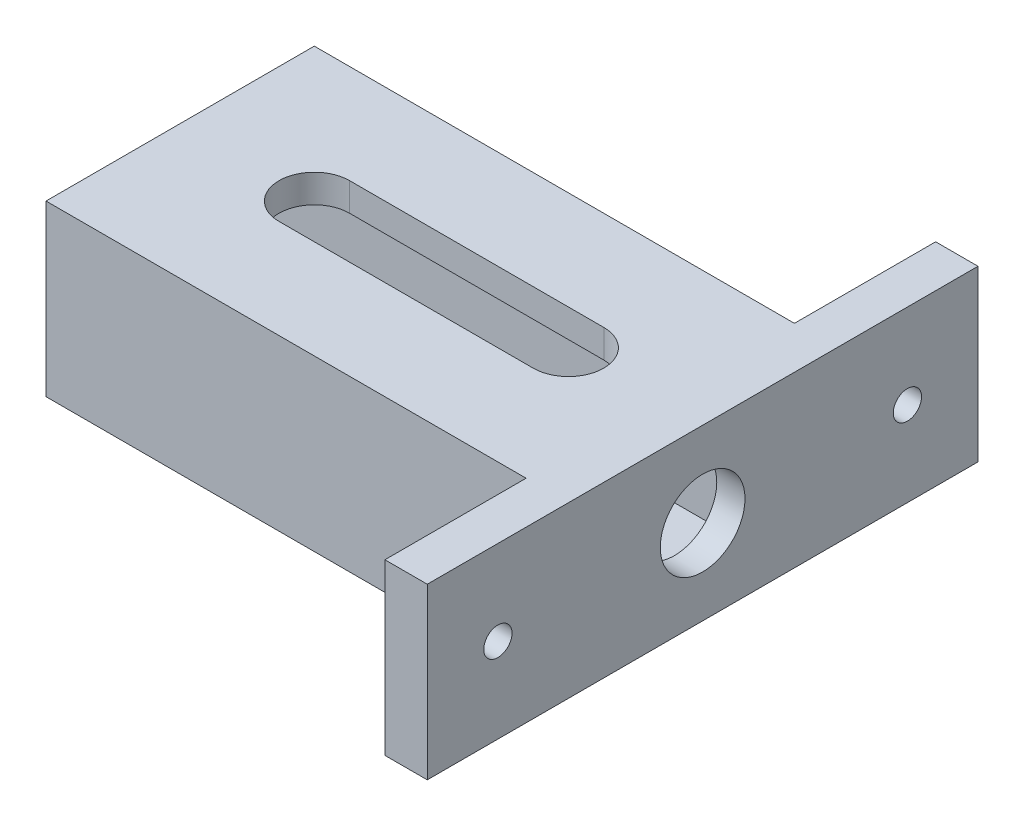
ISO-10303-21;
HEADER;
FILE_DESCRIPTION(('STEP AP214'),'2;1');
FILE_NAME('part.step','',(''),(''),'','','');
FILE_SCHEMA(('AUTOMOTIVE_DESIGN { 1 0 10303 214 1 1 1 1 }'));
ENDSEC;
DATA;
#1=APPLICATION_CONTEXT('core data for automotive mechanical design processes');
#2=APPLICATION_PROTOCOL_DEFINITION('international standard','automotive_design',2000,#1);
#3=PRODUCT_CONTEXT('',#1,'mechanical');
#4=PRODUCT('Part','Part','',(#3));
#5=PRODUCT_RELATED_PRODUCT_CATEGORY('part','',(#4));
#6=PRODUCT_DEFINITION_FORMATION('','',#4);
#7=PRODUCT_DEFINITION_CONTEXT('part definition',#1,'design');
#8=PRODUCT_DEFINITION('design','',#6,#7);
#9=PRODUCT_DEFINITION_SHAPE('','',#8);
#10=(LENGTH_UNIT() NAMED_UNIT(*) SI_UNIT(.MILLI.,.METRE.));
#11=(NAMED_UNIT(*) PLANE_ANGLE_UNIT() SI_UNIT($,.RADIAN.));
#12=(NAMED_UNIT(*) SI_UNIT($,.STERADIAN.) SOLID_ANGLE_UNIT());
#13=UNCERTAINTY_MEASURE_WITH_UNIT(LENGTH_MEASURE(1.E-05),#10,'distance_accuracy_value','');
#14=(GEOMETRIC_REPRESENTATION_CONTEXT(3) GLOBAL_UNCERTAINTY_ASSIGNED_CONTEXT((#13)) GLOBAL_UNIT_ASSIGNED_CONTEXT((#10,
#11,#12)) REPRESENTATION_CONTEXT('',''));
#15=CARTESIAN_POINT('',(0.,0.,0.));
#16=DIRECTION('',(0.,0.,1.));
#17=DIRECTION('',(1.,0.,0.));
#18=AXIS2_PLACEMENT_3D('',#15,#16,#17);
#19=CARTESIAN_POINT('',(0.,10.,0.));
#20=DIRECTION('',(0.,-1.,0.));
#21=DIRECTION('',(0.,0.,-1.));
#22=AXIS2_PLACEMENT_3D('',#19,#20,#21);
#23=PLANE('',#22);
#24=DIRECTION('',(-1.,0.,0.));
#25=VECTOR('',#24,1.);
#26=CARTESIAN_POINT('',(0.,10.,2.5));
#27=LINE('',#26,#25);
#28=CARTESIAN_POINT('',(9.,10.,2.5));
#29=VERTEX_POINT('',#28);
#30=CARTESIAN_POINT('',(-9.,10.,2.5));
#31=VERTEX_POINT('',#30);
#32=EDGE_CURVE('E171',#29,#31,#27,.T.);
#33=ORIENTED_EDGE('',*,*,#32,.F.);
#34=CARTESIAN_POINT('',(9.,10.,0.));
#35=DIRECTION('',(0.,-1.,0.));
#36=DIRECTION('',(0.,0.,-1.));
#37=AXIS2_PLACEMENT_3D('',#34,#35,#36);
#38=CIRCLE('',#37,2.5);
#39=CARTESIAN_POINT('',(9.,10.,-2.5));
#40=VERTEX_POINT('',#39);
#41=EDGE_CURVE('E166',#29,#40,#38,.F.);
#42=ORIENTED_EDGE('',*,*,#41,.T.);
#43=DIRECTION('',(-1.,0.,0.));
#44=VECTOR('',#43,1.);
#45=CARTESIAN_POINT('',(0.,10.,-2.5));
#46=LINE('',#45,#44);
#47=CARTESIAN_POINT('',(-9.,10.,-2.5));
#48=VERTEX_POINT('',#47);
#49=EDGE_CURVE('E241',#40,#48,#46,.T.);
#50=ORIENTED_EDGE('',*,*,#49,.T.);
#51=CARTESIAN_POINT('',(-9.,10.,0.));
#52=DIRECTION('',(0.,-1.,0.));
#53=DIRECTION('',(0.,0.,-1.));
#54=AXIS2_PLACEMENT_3D('',#51,#52,#53);
#55=CIRCLE('',#54,2.5);
#56=EDGE_CURVE('E250',#31,#48,#55,.T.);
#57=ORIENTED_EDGE('',*,*,#56,.F.);
#58=EDGE_LOOP('',(#33,#42,#50,#57));
#59=FACE_BOUND('',#58,.T.);
#60=DIRECTION('',(0.,0.,1.));
#61=VECTOR('',#60,1.);
#62=CARTESIAN_POINT('',(16.5,10.,0.));
#63=LINE('',#62,#61);
#64=CARTESIAN_POINT('',(16.5,10.,-4.25));
#65=VERTEX_POINT('',#64);
#66=CARTESIAN_POINT('',(16.5,10.,4.25));
#67=VERTEX_POINT('',#66);
#68=EDGE_CURVE('E158',#65,#67,#63,.T.);
#69=ORIENTED_EDGE('',*,*,#68,.T.);
#70=DIRECTION('',(1.,0.,0.));
#71=VECTOR('',#70,1.);
#72=CARTESIAN_POINT('',(-18.5,10.,4.25));
#73=LINE('',#72,#71);
#74=CARTESIAN_POINT('',(-18.5,10.,4.25));
#75=VERTEX_POINT('',#74);
#76=EDGE_CURVE('E151',#75,#67,#73,.T.);
#77=ORIENTED_EDGE('',*,*,#76,.F.);
#78=DIRECTION('',(0.,0.,1.));
#79=VECTOR('',#78,1.);
#80=CARTESIAN_POINT('',(-18.5,10.,9.5));
#81=LINE('',#80,#79);
#82=CARTESIAN_POINT('',(-18.5,10.,-4.25));
#83=VERTEX_POINT('',#82);
#84=EDGE_CURVE('E51',#83,#75,#81,.T.);
#85=ORIENTED_EDGE('',*,*,#84,.F.);
#86=DIRECTION('',(1.,0.,0.));
#87=VECTOR('',#86,1.);
#88=CARTESIAN_POINT('',(-18.5,10.,-4.25));
#89=LINE('',#88,#87);
#90=EDGE_CURVE('E362',#83,#65,#89,.T.);
#91=ORIENTED_EDGE('',*,*,#90,.T.);
#92=EDGE_LOOP('',(#69,#77,#85,#91));
#93=FACE_BOUND('',#92,.T.);
#94=ADVANCED_FACE('F35',(#59,#93),#23,.T.);
#95=CARTESIAN_POINT('',(0.,2.,0.));
#96=DIRECTION('',(0.,1.,0.));
#97=DIRECTION('',(0.,0.,1.));
#98=AXIS2_PLACEMENT_3D('',#95,#96,#97);
#99=PLANE('',#98);
#100=CARTESIAN_POINT('',(-8.50000000000001,2.,0.));
#101=DIRECTION('',(0.,1.,0.));
#102=DIRECTION('',(0.,0.,1.));
#103=AXIS2_PLACEMENT_3D('',#100,#101,#102);
#104=CIRCLE('',#103,1.25);
#105=CARTESIAN_POINT('',(-8.50000000000001,2.,-1.25));
#106=VERTEX_POINT('',#105);
#107=EDGE_CURVE('E348',#106,#106,#104,.T.);
#108=ORIENTED_EDGE('',*,*,#107,.F.);
#109=EDGE_LOOP('',(#108));
#110=FACE_BOUND('',#109,.T.);
#111=DIRECTION('',(0.,0.,-1.));
#112=VECTOR('',#111,1.);
#113=CARTESIAN_POINT('',(-18.5,2.,0.));
#114=LINE('',#113,#112);
#115=CARTESIAN_POINT('',(-18.5,2.,4.25));
#116=VERTEX_POINT('',#115);
#117=CARTESIAN_POINT('',(-18.5,2.,-4.25));
#118=VERTEX_POINT('',#117);
#119=EDGE_CURVE('E44',#116,#118,#114,.T.);
#120=ORIENTED_EDGE('',*,*,#119,.F.);
#121=DIRECTION('',(1.,0.,0.));
#122=VECTOR('',#121,1.);
#123=CARTESIAN_POINT('',(-18.5,2.,4.25));
#124=LINE('',#123,#122);
#125=CARTESIAN_POINT('',(16.5,2.,4.25));
#126=VERTEX_POINT('',#125);
#127=EDGE_CURVE('E154',#116,#126,#124,.T.);
#128=ORIENTED_EDGE('',*,*,#127,.T.);
#129=DIRECTION('',(0.,0.,1.));
#130=VECTOR('',#129,1.);
#131=CARTESIAN_POINT('',(16.5,2.,0.));
#132=LINE('',#131,#130);
#133=CARTESIAN_POINT('',(16.5,2.,-4.25));
#134=VERTEX_POINT('',#133);
#135=EDGE_CURVE('E11',#134,#126,#132,.T.);
#136=ORIENTED_EDGE('',*,*,#135,.F.);
#137=DIRECTION('',(1.,0.,0.));
#138=VECTOR('',#137,1.);
#139=CARTESIAN_POINT('',(-18.5,2.,-4.25));
#140=LINE('',#139,#138);
#141=EDGE_CURVE('E366',#118,#134,#140,.T.);
#142=ORIENTED_EDGE('',*,*,#141,.F.);
#143=EDGE_LOOP('',(#120,#128,#136,#142));
#144=FACE_BOUND('',#143,.T.);
#145=ADVANCED_FACE('F316',(#110,#144),#99,.T.);
#146=CARTESIAN_POINT('',(16.5,10.,0.));
#147=DIRECTION('',(1.,0.,0.));
#148=DIRECTION('',(0.,0.,-1.));
#149=AXIS2_PLACEMENT_3D('',#146,#147,#148);
#150=PLANE('',#149);
#151=CARTESIAN_POINT('',(16.5,6.,0.));
#152=DIRECTION('',(1.,0.,0.));
#153=DIRECTION('',(0.,0.,-1.));
#154=AXIS2_PLACEMENT_3D('',#151,#152,#153);
#155=CIRCLE('',#154,3.);
#156=CARTESIAN_POINT('',(16.5,6.,-3.));
#157=VERTEX_POINT('',#156);
#158=EDGE_CURVE('E356',#157,#157,#155,.T.);
#159=ORIENTED_EDGE('',*,*,#158,.T.);
#160=EDGE_LOOP('',(#159));
#161=FACE_BOUND('',#160,.T.);
#162=DIRECTION('',(0.,-1.,0.));
#163=VECTOR('',#162,1.);
#164=CARTESIAN_POINT('',(16.5,10.,4.25));
#165=LINE('',#164,#163);
#166=EDGE_CURVE('E155',#67,#126,#165,.T.);
#167=ORIENTED_EDGE('',*,*,#166,.F.);
#168=ORIENTED_EDGE('',*,*,#68,.F.);
#169=DIRECTION('',(0.,1.,0.));
#170=VECTOR('',#169,1.);
#171=CARTESIAN_POINT('',(16.5,10.,-4.25));
#172=LINE('',#171,#170);
#173=EDGE_CURVE('E159',#134,#65,#172,.T.);
#174=ORIENTED_EDGE('',*,*,#173,.F.);
#175=ORIENTED_EDGE('',*,*,#135,.T.);
#176=EDGE_LOOP('',(#167,#168,#174,#175));
#177=FACE_BOUND('',#176,.T.);
#178=ADVANCED_FACE('F322',(#161,#177),#150,.F.);
#179=CARTESIAN_POINT('',(0.,10.,9.5));
#180=DIRECTION('',(0.,0.,1.));
#181=DIRECTION('',(1.,0.,0.));
#182=AXIS2_PLACEMENT_3D('',#179,#180,#181);
#183=PLANE('',#182);
#184=DIRECTION('',(-1.,0.,0.));
#185=VECTOR('',#184,1.);
#186=CARTESIAN_POINT('',(0.,0.,9.5));
#187=LINE('',#186,#185);
#188=CARTESIAN_POINT('',(15.5,0.,9.5));
#189=VERTEX_POINT('',#188);
#190=CARTESIAN_POINT('',(-18.5,0.,9.5));
#191=VERTEX_POINT('',#190);
#192=EDGE_CURVE('E180',#189,#191,#187,.T.);
#193=ORIENTED_EDGE('',*,*,#192,.F.);
#194=DIRECTION('',(0.,1.,0.));
#195=VECTOR('',#194,1.);
#196=CARTESIAN_POINT('',(15.5,0.,9.5));
#197=LINE('',#196,#195);
#198=CARTESIAN_POINT('',(15.5,12.,9.5));
#199=VERTEX_POINT('',#198);
#200=EDGE_CURVE('E266',#189,#199,#197,.T.);
#201=ORIENTED_EDGE('',*,*,#200,.T.);
#202=DIRECTION('',(1.,0.,0.));
#203=VECTOR('',#202,1.);
#204=CARTESIAN_POINT('',(18.5,12.,9.5));
#205=LINE('',#204,#203);
#206=CARTESIAN_POINT('',(-18.5,12.,9.5));
#207=VERTEX_POINT('',#206);
#208=EDGE_CURVE('E175',#207,#199,#205,.T.);
#209=ORIENTED_EDGE('',*,*,#208,.F.);
#210=DIRECTION('',(0.,-1.,0.));
#211=VECTOR('',#210,1.);
#212=CARTESIAN_POINT('',(-18.5,10.,9.5));
#213=LINE('',#212,#211);
#214=EDGE_CURVE('E187',#207,#191,#213,.T.);
#215=ORIENTED_EDGE('',*,*,#214,.T.);
#216=EDGE_LOOP('',(#193,#201,#209,#215));
#217=FACE_BOUND('',#216,.T.);
#218=ADVANCED_FACE('F264',(#217),#183,.T.);
#219=CARTESIAN_POINT('',(0.,10.,-9.5));
#220=DIRECTION('',(0.,0.,1.));
#221=DIRECTION('',(1.,0.,0.));
#222=AXIS2_PLACEMENT_3D('',#219,#220,#221);
#223=PLANE('',#222);
#224=DIRECTION('',(0.,1.,0.));
#225=VECTOR('',#224,1.);
#226=CARTESIAN_POINT('',(15.5,0.,-9.5));
#227=LINE('',#226,#225);
#228=CARTESIAN_POINT('',(15.5,0.,-9.5));
#229=VERTEX_POINT('',#228);
#230=CARTESIAN_POINT('',(15.5,12.,-9.5));
#231=VERTEX_POINT('',#230);
#232=EDGE_CURVE('E205',#229,#231,#227,.T.);
#233=ORIENTED_EDGE('',*,*,#232,.F.);
#234=DIRECTION('',(-1.,0.,0.));
#235=VECTOR('',#234,1.);
#236=CARTESIAN_POINT('',(0.,0.,-9.5));
#237=LINE('',#236,#235);
#238=CARTESIAN_POINT('',(-18.5,0.,-9.5));
#239=VERTEX_POINT('',#238);
#240=EDGE_CURVE('E179',#229,#239,#237,.T.);
#241=ORIENTED_EDGE('',*,*,#240,.T.);
#242=DIRECTION('',(0.,-1.,0.));
#243=VECTOR('',#242,1.);
#244=CARTESIAN_POINT('',(-18.5,10.,-9.5));
#245=LINE('',#244,#243);
#246=CARTESIAN_POINT('',(-18.5,12.,-9.5));
#247=VERTEX_POINT('',#246);
#248=EDGE_CURVE('E178',#247,#239,#245,.T.);
#249=ORIENTED_EDGE('',*,*,#248,.F.);
#250=DIRECTION('',(-1.,0.,0.));
#251=VECTOR('',#250,1.);
#252=CARTESIAN_POINT('',(-18.5,12.,-9.5));
#253=LINE('',#252,#251);
#254=EDGE_CURVE('E168',#231,#247,#253,.T.);
#255=ORIENTED_EDGE('',*,*,#254,.F.);
#256=EDGE_LOOP('',(#233,#241,#249,#255));
#257=FACE_BOUND('',#256,.T.);
#258=ADVANCED_FACE('F203',(#257),#223,.F.);
#259=CARTESIAN_POINT('',(0.,12.,0.));
#260=DIRECTION('',(0.,-1.,0.));
#261=DIRECTION('',(0.,0.,-1.));
#262=AXIS2_PLACEMENT_3D('',#259,#260,#261);
#263=PLANE('',#262);
#264=DIRECTION('',(0.,0.,-1.));
#265=VECTOR('',#264,1.);
#266=CARTESIAN_POINT('',(18.5,12.,-9.5));
#267=LINE('',#266,#265);
#268=CARTESIAN_POINT('',(18.5,12.,19.5));
#269=VERTEX_POINT('',#268);
#270=CARTESIAN_POINT('',(18.5,12.,-19.5));
#271=VERTEX_POINT('',#270);
#272=EDGE_CURVE('E165',#269,#271,#267,.T.);
#273=ORIENTED_EDGE('',*,*,#272,.T.);
#274=DIRECTION('',(1.,0.,0.));
#275=VECTOR('',#274,1.);
#276=CARTESIAN_POINT('',(15.5,12.,-19.5));
#277=LINE('',#276,#275);
#278=CARTESIAN_POINT('',(15.5,12.,-19.5));
#279=VERTEX_POINT('',#278);
#280=EDGE_CURVE('E220',#279,#271,#277,.T.);
#281=ORIENTED_EDGE('',*,*,#280,.F.);
#282=DIRECTION('',(0.,0.,1.));
#283=VECTOR('',#282,1.);
#284=CARTESIAN_POINT('',(15.5,12.,-19.5));
#285=LINE('',#284,#283);
#286=EDGE_CURVE('E222',#279,#231,#285,.T.);
#287=ORIENTED_EDGE('',*,*,#286,.T.);
#288=ORIENTED_EDGE('',*,*,#254,.T.);
#289=DIRECTION('',(0.,0.,1.));
#290=VECTOR('',#289,1.);
#291=CARTESIAN_POINT('',(-18.5,12.,9.5));
#292=LINE('',#291,#290);
#293=EDGE_CURVE('E201',#247,#207,#292,.T.);
#294=ORIENTED_EDGE('',*,*,#293,.T.);
#295=ORIENTED_EDGE('',*,*,#208,.T.);
#296=DIRECTION('',(0.,0.,-1.));
#297=VECTOR('',#296,1.);
#298=CARTESIAN_POINT('',(15.5,12.,19.5));
#299=LINE('',#298,#297);
#300=CARTESIAN_POINT('',(15.5,12.,19.5));
#301=VERTEX_POINT('',#300);
#302=EDGE_CURVE('E260',#301,#199,#299,.T.);
#303=ORIENTED_EDGE('',*,*,#302,.F.);
#304=DIRECTION('',(1.,0.,0.));
#305=VECTOR('',#304,1.);
#306=CARTESIAN_POINT('',(15.5,12.,19.5));
#307=LINE('',#306,#305);
#308=EDGE_CURVE('E272',#301,#269,#307,.T.);
#309=ORIENTED_EDGE('',*,*,#308,.T.);
#310=EDGE_LOOP('',(#273,#281,#287,#288,#294,#295,#303,#309));
#311=FACE_BOUND('',#310,.T.);
#312=CARTESIAN_POINT('',(9.,12.,0.));
#313=DIRECTION('',(0.,1.,0.));
#314=DIRECTION('',(0.,0.,1.));
#315=AXIS2_PLACEMENT_3D('',#312,#313,#314);
#316=CIRCLE('',#315,2.5);
#317=CARTESIAN_POINT('',(9.,12.,-2.5));
#318=VERTEX_POINT('',#317);
#319=CARTESIAN_POINT('',(9.,12.,2.5));
#320=VERTEX_POINT('',#319);
#321=EDGE_CURVE('E226',#318,#320,#316,.F.);
#322=ORIENTED_EDGE('',*,*,#321,.T.);
#323=DIRECTION('',(1.,0.,0.));
#324=VECTOR('',#323,1.);
#325=CARTESIAN_POINT('',(0.,12.,2.5));
#326=LINE('',#325,#324);
#327=CARTESIAN_POINT('',(-9.,12.,2.5));
#328=VERTEX_POINT('',#327);
#329=EDGE_CURVE('E235',#328,#320,#326,.T.);
#330=ORIENTED_EDGE('',*,*,#329,.F.);
#331=CARTESIAN_POINT('',(-9.,12.,0.));
#332=DIRECTION('',(0.,1.,0.));
#333=DIRECTION('',(0.,0.,1.));
#334=AXIS2_PLACEMENT_3D('',#331,#332,#333);
#335=CIRCLE('',#334,2.5);
#336=CARTESIAN_POINT('',(-9.,12.,-2.5));
#337=VERTEX_POINT('',#336);
#338=EDGE_CURVE('E232',#337,#328,#335,.T.);
#339=ORIENTED_EDGE('',*,*,#338,.F.);
#340=DIRECTION('',(1.,0.,0.));
#341=VECTOR('',#340,1.);
#342=CARTESIAN_POINT('',(0.,12.,-2.5));
#343=LINE('',#342,#341);
#344=EDGE_CURVE('E229',#337,#318,#343,.T.);
#345=ORIENTED_EDGE('',*,*,#344,.T.);
#346=EDGE_LOOP('',(#322,#330,#339,#345));
#347=FACE_BOUND('',#346,.T.);
#348=ADVANCED_FACE('F257',(#311,#347),#263,.F.);
#349=CARTESIAN_POINT('',(-18.5,2.,0.));
#350=DIRECTION('',(-1.,0.,0.));
#351=DIRECTION('',(0.,0.,1.));
#352=AXIS2_PLACEMENT_3D('',#349,#350,#351);
#353=PLANE('',#352);
#354=ORIENTED_EDGE('',*,*,#84,.T.);
#355=DIRECTION('',(0.,-1.,0.));
#356=VECTOR('',#355,1.);
#357=CARTESIAN_POINT('',(-18.5,10.,4.25));
#358=LINE('',#357,#356);
#359=EDGE_CURVE('E149',#75,#116,#358,.T.);
#360=ORIENTED_EDGE('',*,*,#359,.T.);
#361=ORIENTED_EDGE('',*,*,#119,.T.);
#362=DIRECTION('',(0.,1.,0.));
#363=VECTOR('',#362,1.);
#364=CARTESIAN_POINT('',(-18.5,10.,-4.25));
#365=LINE('',#364,#363);
#366=EDGE_CURVE('E163',#118,#83,#365,.T.);
#367=ORIENTED_EDGE('',*,*,#366,.T.);
#368=EDGE_LOOP('',(#354,#360,#361,#367));
#369=FACE_BOUND('',#368,.T.);
#370=DIRECTION('',(0.,0.,-1.));
#371=VECTOR('',#370,1.);
#372=CARTESIAN_POINT('',(-18.5,0.,0.));
#373=LINE('',#372,#371);
#374=EDGE_CURVE('E39',#191,#239,#373,.T.);
#375=ORIENTED_EDGE('',*,*,#374,.F.);
#376=ORIENTED_EDGE('',*,*,#214,.F.);
#377=ORIENTED_EDGE('',*,*,#293,.F.);
#378=ORIENTED_EDGE('',*,*,#248,.T.);
#379=EDGE_LOOP('',(#375,#376,#377,#378));
#380=FACE_BOUND('',#379,.T.);
#381=ADVANCED_FACE('F37',(#369,#380),#353,.T.);
#382=CARTESIAN_POINT('',(0.,0.,0.));
#383=DIRECTION('',(0.,1.,0.));
#384=DIRECTION('',(0.,0.,1.));
#385=AXIS2_PLACEMENT_3D('',#382,#383,#384);
#386=PLANE('',#385);
#387=CARTESIAN_POINT('',(-8.50000000000001,0.,0.));
#388=DIRECTION('',(0.,-1.,0.));
#389=DIRECTION('',(0.,0.,-1.));
#390=AXIS2_PLACEMENT_3D('',#387,#388,#389);
#391=CIRCLE('',#390,1.25);
#392=CARTESIAN_POINT('',(-8.50000000000001,0.,-1.25));
#393=VERTEX_POINT('',#392);
#394=EDGE_CURVE('E346',#393,#393,#391,.T.);
#395=ORIENTED_EDGE('',*,*,#394,.F.);
#396=EDGE_LOOP('',(#395));
#397=FACE_BOUND('',#396,.T.);
#398=ORIENTED_EDGE('',*,*,#374,.T.);
#399=ORIENTED_EDGE('',*,*,#240,.F.);
#400=DIRECTION('',(0.,0.,1.));
#401=VECTOR('',#400,1.);
#402=CARTESIAN_POINT('',(15.5,0.,-19.5));
#403=LINE('',#402,#401);
#404=CARTESIAN_POINT('',(15.5,0.,-19.5));
#405=VERTEX_POINT('',#404);
#406=EDGE_CURVE('E224',#405,#229,#403,.T.);
#407=ORIENTED_EDGE('',*,*,#406,.F.);
#408=DIRECTION('',(-1.,0.,0.));
#409=VECTOR('',#408,1.);
#410=CARTESIAN_POINT('',(18.5,0.,-19.5));
#411=LINE('',#410,#409);
#412=CARTESIAN_POINT('',(18.5,0.,-19.5));
#413=VERTEX_POINT('',#412);
#414=EDGE_CURVE('E213',#413,#405,#411,.T.);
#415=ORIENTED_EDGE('',*,*,#414,.F.);
#416=DIRECTION('',(0.,0.,-1.));
#417=VECTOR('',#416,1.);
#418=CARTESIAN_POINT('',(18.5,0.,0.));
#419=LINE('',#418,#417);
#420=CARTESIAN_POINT('',(18.5,0.,19.5));
#421=VERTEX_POINT('',#420);
#422=EDGE_CURVE('E182',#421,#413,#419,.T.);
#423=ORIENTED_EDGE('',*,*,#422,.F.);
#424=DIRECTION('',(-1.,0.,0.));
#425=VECTOR('',#424,1.);
#426=CARTESIAN_POINT('',(18.5,0.,19.5));
#427=LINE('',#426,#425);
#428=CARTESIAN_POINT('',(15.5,0.,19.5));
#429=VERTEX_POINT('',#428);
#430=EDGE_CURVE('E279',#421,#429,#427,.T.);
#431=ORIENTED_EDGE('',*,*,#430,.T.);
#432=DIRECTION('',(0.,0.,-1.));
#433=VECTOR('',#432,1.);
#434=CARTESIAN_POINT('',(15.5,0.,19.5));
#435=LINE('',#434,#433);
#436=EDGE_CURVE('E281',#429,#189,#435,.T.);
#437=ORIENTED_EDGE('',*,*,#436,.T.);
#438=ORIENTED_EDGE('',*,*,#192,.T.);
#439=EDGE_LOOP('',(#398,#399,#407,#415,#423,#431,#437,#438));
#440=FACE_BOUND('',#439,.T.);
#441=ADVANCED_FACE('F194',(#397,#440),#386,.F.);
#442=CARTESIAN_POINT('',(18.5,10.,0.));
#443=DIRECTION('',(-1.,0.,0.));
#444=DIRECTION('',(0.,0.,1.));
#445=AXIS2_PLACEMENT_3D('',#442,#443,#444);
#446=PLANE('',#445);
#447=CARTESIAN_POINT('',(18.5,6.,0.));
#448=DIRECTION('',(1.,0.,0.));
#449=DIRECTION('',(0.,0.,-1.));
#450=AXIS2_PLACEMENT_3D('',#447,#448,#449);
#451=CIRCLE('',#450,3.);
#452=CARTESIAN_POINT('',(18.5,6.,-3.));
#453=VERTEX_POINT('',#452);
#454=EDGE_CURVE('E351',#453,#453,#451,.T.);
#455=ORIENTED_EDGE('',*,*,#454,.F.);
#456=EDGE_LOOP('',(#455));
#457=FACE_BOUND('',#456,.T.);
#458=CARTESIAN_POINT('',(18.5,6.,14.5));
#459=DIRECTION('',(-1.,0.,0.));
#460=DIRECTION('',(0.,0.,1.));
#461=AXIS2_PLACEMENT_3D('',#458,#459,#460);
#462=CIRCLE('',#461,1.);
#463=CARTESIAN_POINT('',(18.5,6.,15.5));
#464=VERTEX_POINT('',#463);
#465=EDGE_CURVE('E269',#464,#464,#462,.F.);
#466=ORIENTED_EDGE('',*,*,#465,.F.);
#467=EDGE_LOOP('',(#466));
#468=FACE_BOUND('',#467,.T.);
#469=CARTESIAN_POINT('',(18.5,6.,-14.5));
#470=DIRECTION('',(-1.,0.,0.));
#471=DIRECTION('',(0.,0.,1.));
#472=AXIS2_PLACEMENT_3D('',#469,#470,#471);
#473=CIRCLE('',#472,1.);
#474=CARTESIAN_POINT('',(18.5,6.,-13.5));
#475=VERTEX_POINT('',#474);
#476=EDGE_CURVE('E210',#475,#475,#473,.T.);
#477=ORIENTED_EDGE('',*,*,#476,.T.);
#478=EDGE_LOOP('',(#477));
#479=FACE_BOUND('',#478,.T.);
#480=ORIENTED_EDGE('',*,*,#422,.T.);
#481=DIRECTION('',(0.,-1.,0.));
#482=VECTOR('',#481,1.);
#483=CARTESIAN_POINT('',(18.5,12.,-19.5));
#484=LINE('',#483,#482);
#485=EDGE_CURVE('E209',#271,#413,#484,.T.);
#486=ORIENTED_EDGE('',*,*,#485,.F.);
#487=ORIENTED_EDGE('',*,*,#272,.F.);
#488=DIRECTION('',(0.,-1.,0.));
#489=VECTOR('',#488,1.);
#490=CARTESIAN_POINT('',(18.5,12.,19.5));
#491=LINE('',#490,#489);
#492=EDGE_CURVE('E268',#269,#421,#491,.T.);
#493=ORIENTED_EDGE('',*,*,#492,.T.);
#494=EDGE_LOOP('',(#480,#486,#487,#493));
#495=FACE_BOUND('',#494,.T.);
#496=ADVANCED_FACE('F294',(#457,#468,#479,#495),#446,.F.);
#497=CARTESIAN_POINT('',(9.,9.,0.));
#498=DIRECTION('',(0.,1.,0.));
#499=DIRECTION('',(0.,0.,1.));
#500=AXIS2_PLACEMENT_3D('',#497,#498,#499);
#501=CYLINDRICAL_SURFACE('',#500,2.5);
#502=DIRECTION('',(0.,1.,0.));
#503=VECTOR('',#502,1.);
#504=CARTESIAN_POINT('',(9.,9.,2.5));
#505=LINE('',#504,#503);
#506=EDGE_CURVE('E239',#29,#320,#505,.T.);
#507=ORIENTED_EDGE('',*,*,#506,.T.);
#508=ORIENTED_EDGE('',*,*,#321,.F.);
#509=DIRECTION('',(0.,1.,0.));
#510=VECTOR('',#509,1.);
#511=CARTESIAN_POINT('',(9.,9.,-2.5));
#512=LINE('',#511,#510);
#513=EDGE_CURVE('E238',#40,#318,#512,.T.);
#514=ORIENTED_EDGE('',*,*,#513,.F.);
#515=ORIENTED_EDGE('',*,*,#41,.F.);
#516=EDGE_LOOP('',(#507,#508,#514,#515));
#517=FACE_BOUND('',#516,.T.);
#518=ADVANCED_FACE('F333',(#517),#501,.F.);
#519=CARTESIAN_POINT('',(0.,9.,2.5));
#520=DIRECTION('',(0.,0.,1.));
#521=DIRECTION('',(1.,0.,0.));
#522=AXIS2_PLACEMENT_3D('',#519,#520,#521);
#523=PLANE('',#522);
#524=ORIENTED_EDGE('',*,*,#32,.T.);
#525=DIRECTION('',(0.,1.,0.));
#526=VECTOR('',#525,1.);
#527=CARTESIAN_POINT('',(-9.,9.,2.5));
#528=LINE('',#527,#526);
#529=EDGE_CURVE('E242',#31,#328,#528,.T.);
#530=ORIENTED_EDGE('',*,*,#529,.T.);
#531=ORIENTED_EDGE('',*,*,#329,.T.);
#532=ORIENTED_EDGE('',*,*,#506,.F.);
#533=EDGE_LOOP('',(#524,#530,#531,#532));
#534=FACE_BOUND('',#533,.T.);
#535=ADVANCED_FACE('F556',(#534),#523,.F.);
#536=CARTESIAN_POINT('',(-9.,9.,0.));
#537=DIRECTION('',(0.,1.,0.));
#538=DIRECTION('',(0.,0.,1.));
#539=AXIS2_PLACEMENT_3D('',#536,#537,#538);
#540=CYLINDRICAL_SURFACE('',#539,2.5);
#541=ORIENTED_EDGE('',*,*,#56,.T.);
#542=DIRECTION('',(0.,1.,0.));
#543=VECTOR('',#542,1.);
#544=CARTESIAN_POINT('',(-9.,9.,-2.5));
#545=LINE('',#544,#543);
#546=EDGE_CURVE('E244',#48,#337,#545,.T.);
#547=ORIENTED_EDGE('',*,*,#546,.T.);
#548=ORIENTED_EDGE('',*,*,#338,.T.);
#549=ORIENTED_EDGE('',*,*,#529,.F.);
#550=EDGE_LOOP('',(#541,#547,#548,#549));
#551=FACE_BOUND('',#550,.T.);
#552=ADVANCED_FACE('F310',(#551),#540,.F.);
#553=CARTESIAN_POINT('',(0.,9.,-2.5));
#554=DIRECTION('',(0.,0.,1.));
#555=DIRECTION('',(1.,0.,0.));
#556=AXIS2_PLACEMENT_3D('',#553,#554,#555);
#557=PLANE('',#556);
#558=ORIENTED_EDGE('',*,*,#513,.T.);
#559=ORIENTED_EDGE('',*,*,#344,.F.);
#560=ORIENTED_EDGE('',*,*,#546,.F.);
#561=ORIENTED_EDGE('',*,*,#49,.F.);
#562=EDGE_LOOP('',(#558,#559,#560,#561));
#563=FACE_BOUND('',#562,.T.);
#564=ADVANCED_FACE('F301',(#563),#557,.T.);
#565=CARTESIAN_POINT('',(15.5,0.,-19.5));
#566=DIRECTION('',(1.,0.,0.));
#567=DIRECTION('',(0.,0.,-1.));
#568=AXIS2_PLACEMENT_3D('',#565,#566,#567);
#569=PLANE('',#568);
#570=CARTESIAN_POINT('',(15.5,6.,-14.5));
#571=DIRECTION('',(-1.,0.,0.));
#572=DIRECTION('',(0.,0.,1.));
#573=AXIS2_PLACEMENT_3D('',#570,#571,#572);
#574=CIRCLE('',#573,1.);
#575=CARTESIAN_POINT('',(15.5,6.,-13.5));
#576=VERTEX_POINT('',#575);
#577=EDGE_CURVE('E216',#576,#576,#574,.T.);
#578=ORIENTED_EDGE('',*,*,#577,.F.);
#579=EDGE_LOOP('',(#578));
#580=FACE_BOUND('',#579,.T.);
#581=ORIENTED_EDGE('',*,*,#232,.T.);
#582=ORIENTED_EDGE('',*,*,#286,.F.);
#583=DIRECTION('',(0.,1.,0.));
#584=VECTOR('',#583,1.);
#585=CARTESIAN_POINT('',(15.5,0.,-19.5));
#586=LINE('',#585,#584);
#587=EDGE_CURVE('E286',#405,#279,#586,.T.);
#588=ORIENTED_EDGE('',*,*,#587,.F.);
#589=ORIENTED_EDGE('',*,*,#406,.T.);
#590=EDGE_LOOP('',(#581,#582,#588,#589));
#591=FACE_BOUND('',#590,.T.);
#592=ADVANCED_FACE('F299',(#580,#591),#569,.F.);
#593=CARTESIAN_POINT('',(0.,0.,-19.5));
#594=DIRECTION('',(0.,0.,-1.));
#595=DIRECTION('',(-1.,0.,0.));
#596=AXIS2_PLACEMENT_3D('',#593,#594,#595);
#597=PLANE('',#596);
#598=ORIENTED_EDGE('',*,*,#485,.T.);
#599=ORIENTED_EDGE('',*,*,#414,.T.);
#600=ORIENTED_EDGE('',*,*,#587,.T.);
#601=ORIENTED_EDGE('',*,*,#280,.T.);
#602=EDGE_LOOP('',(#598,#599,#600,#601));
#603=FACE_BOUND('',#602,.T.);
#604=ADVANCED_FACE('F292',(#603),#597,.T.);
#605=CARTESIAN_POINT('',(25.5,6.,-14.5));
#606=DIRECTION('',(-1.,0.,0.));
#607=DIRECTION('',(0.,0.,1.));
#608=AXIS2_PLACEMENT_3D('',#605,#606,#607);
#609=CYLINDRICAL_SURFACE('',#608,1.);
#610=ORIENTED_EDGE('',*,*,#577,.T.);
#611=EDGE_LOOP('',(#610));
#612=FACE_BOUND('',#611,.T.);
#613=ORIENTED_EDGE('',*,*,#476,.F.);
#614=EDGE_LOOP('',(#613));
#615=FACE_BOUND('',#614,.T.);
#616=ADVANCED_FACE('F308',(#612,#615),#609,.F.);
#617=CARTESIAN_POINT('',(15.5,0.,19.5));
#618=DIRECTION('',(-1.,0.,0.));
#619=DIRECTION('',(0.,0.,1.));
#620=AXIS2_PLACEMENT_3D('',#617,#618,#619);
#621=PLANE('',#620);
#622=CARTESIAN_POINT('',(15.5,6.,14.5));
#623=DIRECTION('',(1.,0.,0.));
#624=DIRECTION('',(0.,0.,-1.));
#625=AXIS2_PLACEMENT_3D('',#622,#623,#624);
#626=CIRCLE('',#625,1.);
#627=CARTESIAN_POINT('',(15.5,6.,13.5));
#628=VERTEX_POINT('',#627);
#629=EDGE_CURVE('E275',#628,#628,#626,.T.);
#630=ORIENTED_EDGE('',*,*,#629,.T.);
#631=EDGE_LOOP('',(#630));
#632=FACE_BOUND('',#631,.T.);
#633=ORIENTED_EDGE('',*,*,#200,.F.);
#634=ORIENTED_EDGE('',*,*,#436,.F.);
#635=DIRECTION('',(0.,1.,0.));
#636=VECTOR('',#635,1.);
#637=CARTESIAN_POINT('',(15.5,0.,19.5));
#638=LINE('',#637,#636);
#639=EDGE_CURVE('E371',#429,#301,#638,.T.);
#640=ORIENTED_EDGE('',*,*,#639,.T.);
#641=ORIENTED_EDGE('',*,*,#302,.T.);
#642=EDGE_LOOP('',(#633,#634,#640,#641));
#643=FACE_BOUND('',#642,.T.);
#644=ADVANCED_FACE('F378',(#632,#643),#621,.T.);
#645=CARTESIAN_POINT('',(0.,0.,19.5));
#646=DIRECTION('',(0.,0.,1.));
#647=DIRECTION('',(-1.,0.,0.));
#648=AXIS2_PLACEMENT_3D('',#645,#646,#647);
#649=PLANE('',#648);
#650=ORIENTED_EDGE('',*,*,#492,.F.);
#651=ORIENTED_EDGE('',*,*,#308,.F.);
#652=ORIENTED_EDGE('',*,*,#639,.F.);
#653=ORIENTED_EDGE('',*,*,#430,.F.);
#654=EDGE_LOOP('',(#650,#651,#652,#653));
#655=FACE_BOUND('',#654,.T.);
#656=ADVANCED_FACE('F375',(#655),#649,.T.);
#657=CARTESIAN_POINT('',(25.5,6.,14.5));
#658=DIRECTION('',(-1.,0.,0.));
#659=DIRECTION('',(0.,0.,1.));
#660=AXIS2_PLACEMENT_3D('',#657,#658,#659);
#661=CYLINDRICAL_SURFACE('',#660,1.);
#662=ORIENTED_EDGE('',*,*,#629,.F.);
#663=EDGE_LOOP('',(#662));
#664=FACE_BOUND('',#663,.T.);
#665=ORIENTED_EDGE('',*,*,#465,.T.);
#666=EDGE_LOOP('',(#665));
#667=FACE_BOUND('',#666,.T.);
#668=ADVANCED_FACE('F377',(#664,#667),#661,.F.);
#669=CARTESIAN_POINT('',(-18.5,10.,-4.25));
#670=DIRECTION('',(0.,0.,-1.));
#671=DIRECTION('',(0.,1.,0.));
#672=AXIS2_PLACEMENT_3D('',#669,#670,#671);
#673=PLANE('',#672);
#674=ORIENTED_EDGE('',*,*,#173,.T.);
#675=ORIENTED_EDGE('',*,*,#90,.F.);
#676=ORIENTED_EDGE('',*,*,#366,.F.);
#677=ORIENTED_EDGE('',*,*,#141,.T.);
#678=EDGE_LOOP('',(#674,#675,#676,#677));
#679=FACE_BOUND('',#678,.T.);
#680=ADVANCED_FACE('F384',(#679),#673,.F.);
#681=CARTESIAN_POINT('',(-18.5,10.,4.25));
#682=DIRECTION('',(0.,0.,1.));
#683=DIRECTION('',(0.,-1.,0.));
#684=AXIS2_PLACEMENT_3D('',#681,#682,#683);
#685=PLANE('',#684);
#686=ORIENTED_EDGE('',*,*,#166,.T.);
#687=ORIENTED_EDGE('',*,*,#127,.F.);
#688=ORIENTED_EDGE('',*,*,#359,.F.);
#689=ORIENTED_EDGE('',*,*,#76,.T.);
#690=EDGE_LOOP('',(#686,#687,#688,#689));
#691=FACE_BOUND('',#690,.T.);
#692=ADVANCED_FACE('F150',(#691),#685,.F.);
#693=CARTESIAN_POINT('',(-16.5,6.,0.));
#694=DIRECTION('',(1.,0.,0.));
#695=DIRECTION('',(0.,0.,-1.));
#696=AXIS2_PLACEMENT_3D('',#693,#694,#695);
#697=CYLINDRICAL_SURFACE('',#696,3.);
#698=ORIENTED_EDGE('',*,*,#454,.T.);
#699=EDGE_LOOP('',(#698));
#700=FACE_BOUND('',#699,.T.);
#701=ORIENTED_EDGE('',*,*,#158,.F.);
#702=EDGE_LOOP('',(#701));
#703=FACE_BOUND('',#702,.T.);
#704=ADVANCED_FACE('F450',(#700,#703),#697,.F.);
#705=CARTESIAN_POINT('',(-8.50000000000001,4.99999999999997,0.));
#706=DIRECTION('',(0.,-1.,0.));
#707=DIRECTION('',(0.,0.,-1.));
#708=AXIS2_PLACEMENT_3D('',#705,#706,#707);
#709=CYLINDRICAL_SURFACE('',#708,1.25);
#710=CARTESIAN_POINT('',(-8.50000000000001,2.,-1.25));
#711=CARTESIAN_POINT('',(-8.50000000000001,1.97916666666667,-1.25));
#712=CARTESIAN_POINT('',(-8.50000000000001,1.95833333333333,-1.25));
#713=CARTESIAN_POINT('',(-8.50000000000001,1.91666666666667,-1.25));
#714=CARTESIAN_POINT('',(-8.50000000000001,1.89583333333333,-1.25));
#715=CARTESIAN_POINT('',(-8.50000000000001,1.85416666666667,-1.25));
#716=CARTESIAN_POINT('',(-8.50000000000001,1.83333333333333,-1.25));
#717=CARTESIAN_POINT('',(-8.50000000000001,1.79166666666667,-1.25));
#718=CARTESIAN_POINT('',(-8.50000000000001,1.77083333333333,-1.25));
#719=CARTESIAN_POINT('',(-8.50000000000001,1.72916666666667,-1.25));
#720=CARTESIAN_POINT('',(-8.50000000000001,1.70833333333333,-1.25));
#721=CARTESIAN_POINT('',(-8.50000000000001,1.66666666666667,-1.25));
#722=CARTESIAN_POINT('',(-8.50000000000001,1.64583333333333,-1.25));
#723=CARTESIAN_POINT('',(-8.50000000000001,1.60416666666667,-1.25));
#724=CARTESIAN_POINT('',(-8.50000000000001,1.58333333333333,-1.25));
#725=CARTESIAN_POINT('',(-8.50000000000001,1.54166666666667,-1.25));
#726=CARTESIAN_POINT('',(-8.50000000000001,1.52083333333333,-1.25));
#727=CARTESIAN_POINT('',(-8.50000000000001,1.47916666666667,-1.25));
#728=CARTESIAN_POINT('',(-8.50000000000001,1.45833333333333,-1.25));
#729=CARTESIAN_POINT('',(-8.50000000000001,1.41666666666667,-1.25));
#730=CARTESIAN_POINT('',(-8.50000000000001,1.39583333333333,-1.25));
#731=CARTESIAN_POINT('',(-8.50000000000001,1.35416666666667,-1.25));
#732=CARTESIAN_POINT('',(-8.50000000000001,1.33333333333333,-1.25));
#733=CARTESIAN_POINT('',(-8.50000000000001,1.29166666666667,-1.25));
#734=CARTESIAN_POINT('',(-8.50000000000001,1.27083333333333,-1.25));
#735=CARTESIAN_POINT('',(-8.50000000000001,1.22916666666667,-1.25));
#736=CARTESIAN_POINT('',(-8.50000000000001,1.20833333333333,-1.25));
#737=CARTESIAN_POINT('',(-8.50000000000001,1.16666666666667,-1.25));
#738=CARTESIAN_POINT('',(-8.50000000000001,1.14583333333333,-1.25));
#739=CARTESIAN_POINT('',(-8.50000000000001,1.10416666666667,-1.25));
#740=CARTESIAN_POINT('',(-8.50000000000001,1.08333333333333,-1.25));
#741=CARTESIAN_POINT('',(-8.50000000000001,1.04166666666667,-1.25));
#742=CARTESIAN_POINT('',(-8.50000000000001,1.02083333333333,-1.25));
#743=CARTESIAN_POINT('',(-8.50000000000001,0.979166666666667,-1.25));
#744=CARTESIAN_POINT('',(-8.50000000000001,0.958333333333333,-1.25));
#745=CARTESIAN_POINT('',(-8.50000000000001,0.916666666666667,-1.25));
#746=CARTESIAN_POINT('',(-8.50000000000001,0.895833333333334,-1.25));
#747=CARTESIAN_POINT('',(-8.50000000000001,0.854166666666667,-1.25));
#748=CARTESIAN_POINT('',(-8.50000000000001,0.833333333333334,-1.25));
#749=CARTESIAN_POINT('',(-8.50000000000001,0.791666666666667,-1.25));
#750=CARTESIAN_POINT('',(-8.50000000000001,0.770833333333334,-1.25));
#751=CARTESIAN_POINT('',(-8.50000000000001,0.729166666666667,-1.25));
#752=CARTESIAN_POINT('',(-8.50000000000001,0.708333333333334,-1.25));
#753=CARTESIAN_POINT('',(-8.50000000000001,0.666666666666667,-1.25));
#754=CARTESIAN_POINT('',(-8.50000000000001,0.645833333333334,-1.25));
#755=CARTESIAN_POINT('',(-8.50000000000001,0.604166666666667,-1.25));
#756=CARTESIAN_POINT('',(-8.50000000000001,0.583333333333334,-1.25));
#757=CARTESIAN_POINT('',(-8.50000000000001,0.541666666666667,-1.25));
#758=CARTESIAN_POINT('',(-8.50000000000001,0.520833333333334,-1.25));
#759=CARTESIAN_POINT('',(-8.50000000000001,0.479166666666667,-1.25));
#760=CARTESIAN_POINT('',(-8.50000000000001,0.458333333333334,-1.25));
#761=CARTESIAN_POINT('',(-8.50000000000001,0.416666666666667,-1.25));
#762=CARTESIAN_POINT('',(-8.50000000000001,0.395833333333334,-1.25));
#763=CARTESIAN_POINT('',(-8.50000000000001,0.354166666666668,-1.25));
#764=CARTESIAN_POINT('',(-8.50000000000001,0.333333333333335,-1.25));
#765=CARTESIAN_POINT('',(-8.50000000000001,0.291666666666668,-1.25));
#766=CARTESIAN_POINT('',(-8.50000000000001,0.270833333333334,-1.25));
#767=CARTESIAN_POINT('',(-8.50000000000001,0.229166666666668,-1.25));
#768=CARTESIAN_POINT('',(-8.50000000000001,0.208333333333334,-1.25));
#769=CARTESIAN_POINT('',(-8.50000000000001,0.166666666666668,-1.25));
#770=CARTESIAN_POINT('',(-8.50000000000001,0.145833333333334,-1.25));
#771=CARTESIAN_POINT('',(-8.50000000000001,0.104166666666668,-1.25));
#772=CARTESIAN_POINT('',(-8.50000000000001,0.0833333333333343,-1.25));
#773=CARTESIAN_POINT('',(-8.50000000000001,0.0416666666666676,-1.25));
#774=CARTESIAN_POINT('',(-8.50000000000001,0.0208333333333342,-1.25));
#775=CARTESIAN_POINT('',(-8.50000000000001,0.,-1.25));
#776=B_SPLINE_CURVE_WITH_KNOTS('',3,(#710,#711,#712,#713,#714,#715,#716,#717,#718,#719,#720,
#721,#722,#723,#724,#725,#726,#727,#728,#729,#730,#731,#732,#733,#734,#735,#736,#737,#738,#739,
#740,#741,#742,#743,#744,#745,#746,#747,#748,#749,#750,#751,#752,#753,#754,#755,#756,#757,#758,
#759,#760,#761,#762,#763,#764,#765,#766,#767,#768,#769,#770,#771,#772,#773,#774,#775),
.UNSPECIFIED.,.F.,.F.,(4,2,2,2,2,2,2,2,2,2,2,2,2,2,2,2,2,2,2,2,2,2,2,2,2,2,2,2,2,2,2,2,4),(0.,
0.0625000000000001,0.125,0.1875,0.25,0.3125,0.375,0.4375,0.5,0.5625,0.625,0.6875,0.75,0.8125,
0.875,0.9375,1.,1.0625,1.125,1.1875,1.25,1.3125,1.375,1.4375,1.5,1.5625,1.625,1.6875,1.75,
1.8125,1.875,1.9375,2.),.UNSPECIFIED.);
#777=EDGE_CURVE('BSEAM473',#106,#393,#776,.T.);
#778=ORIENTED_EDGE('',*,*,#107,.T.);
#779=ORIENTED_EDGE('',*,*,#394,.T.);
#780=ORIENTED_EDGE('',*,*,#777,.T.);
#781=ORIENTED_EDGE('',*,*,#777,.F.);
#782=EDGE_LOOP('',(#778,#780,#779,#781));
#783=FACE_BOUND('',#782,.T.);
#784=ADVANCED_FACE('F473',(#783),#709,.F.);
#785=CLOSED_SHELL('',(#94,#145,#178,#218,#258,#348,#381,#441,#496,#518,#535,#552,#564,#592,#604,
#616,#644,#656,#668,#680,#692,#704,#784));
#786=MANIFOLD_SOLID_BREP('B2',#785);
#787=ADVANCED_BREP_SHAPE_REPRESENTATION('',(#18,#786),#14);
#788=SHAPE_DEFINITION_REPRESENTATION(#9,#787);
ENDSEC;
END-ISO-10303-21;
